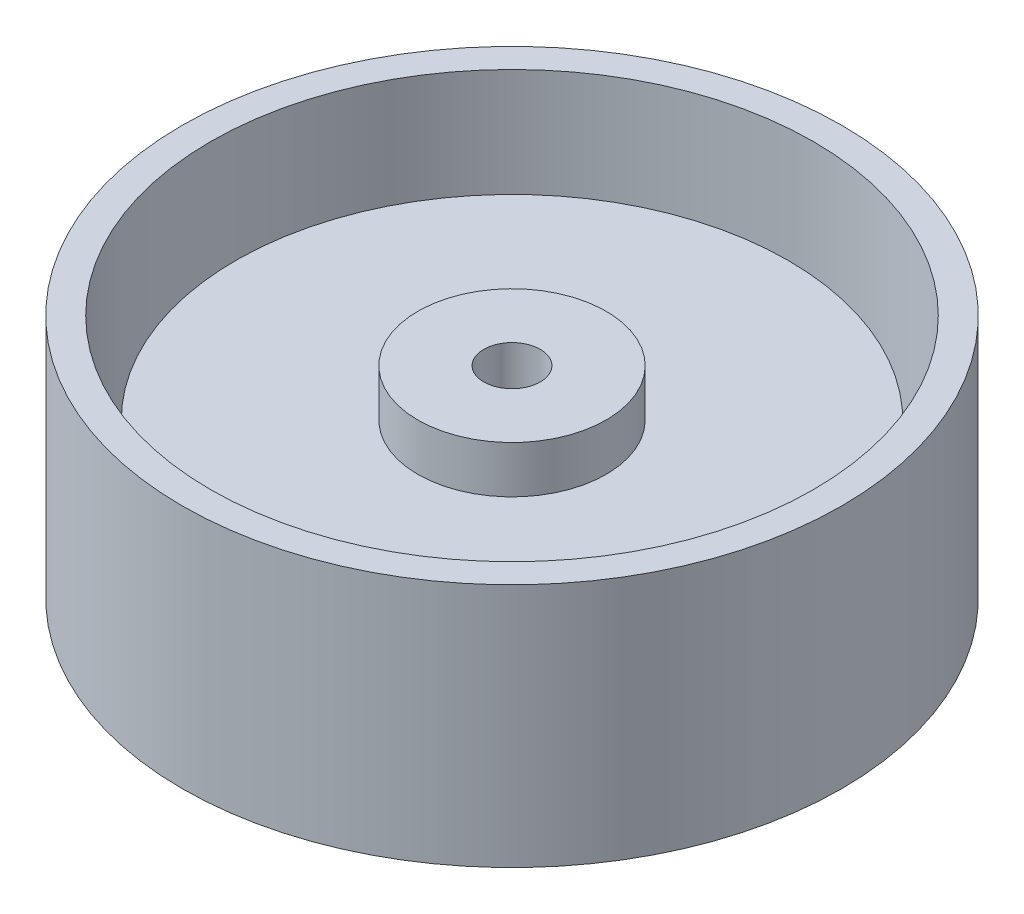
ISO-10303-21;
HEADER;
FILE_DESCRIPTION(('STEP AP214'),'2;1');
FILE_NAME('part.step','',(''),(''),'','','');
FILE_SCHEMA(('AUTOMOTIVE_DESIGN { 1 0 10303 214 1 1 1 1 }'));
ENDSEC;
DATA;
#1=APPLICATION_CONTEXT('core data for automotive mechanical design processes');
#2=APPLICATION_PROTOCOL_DEFINITION('international standard','automotive_design',2000,#1);
#3=PRODUCT_CONTEXT('',#1,'mechanical');
#4=PRODUCT('Part','Part','',(#3));
#5=PRODUCT_RELATED_PRODUCT_CATEGORY('part','',(#4));
#6=PRODUCT_DEFINITION_FORMATION('','',#4);
#7=PRODUCT_DEFINITION_CONTEXT('part definition',#1,'design');
#8=PRODUCT_DEFINITION('design','',#6,#7);
#9=PRODUCT_DEFINITION_SHAPE('','',#8);
#10=(LENGTH_UNIT() NAMED_UNIT(*) SI_UNIT(.MILLI.,.METRE.));
#11=(NAMED_UNIT(*) PLANE_ANGLE_UNIT() SI_UNIT($,.RADIAN.));
#12=(NAMED_UNIT(*) SI_UNIT($,.STERADIAN.) SOLID_ANGLE_UNIT());
#13=UNCERTAINTY_MEASURE_WITH_UNIT(LENGTH_MEASURE(1.E-05),#10,'distance_accuracy_value','');
#14=(GEOMETRIC_REPRESENTATION_CONTEXT(3) GLOBAL_UNCERTAINTY_ASSIGNED_CONTEXT((#13)) GLOBAL_UNIT_ASSIGNED_CONTEXT((#10,
#11,#12)) REPRESENTATION_CONTEXT('',''));
#15=CARTESIAN_POINT('',(0.,0.,0.));
#16=DIRECTION('',(0.,0.,1.));
#17=DIRECTION('',(1.,0.,0.));
#18=AXIS2_PLACEMENT_3D('',#15,#16,#17);
#19=CARTESIAN_POINT('',(0.,16.4,0.));
#20=DIRECTION('',(0.,1.,0.));
#21=DIRECTION('',(0.,0.,1.));
#22=AXIS2_PLACEMENT_3D('',#19,#20,#21);
#23=PLANE('',#22);
#24=CARTESIAN_POINT('',(0.,16.4,0.));
#25=DIRECTION('',(0.,1.,0.));
#26=DIRECTION('',(0.,0.,1.));
#27=AXIS2_PLACEMENT_3D('',#24,#25,#26);
#28=CIRCLE('',#27,29.33);
#29=CARTESIAN_POINT('',(0.,16.4,-29.33));
#30=VERTEX_POINT('',#29);
#31=EDGE_CURVE('E101',#30,#30,#28,.T.);
#32=ORIENTED_EDGE('',*,*,#31,.T.);
#33=EDGE_LOOP('',(#32));
#34=FACE_BOUND('',#33,.T.);
#35=CARTESIAN_POINT('',(0.,16.4,0.));
#36=DIRECTION('',(0.,1.,0.));
#37=DIRECTION('',(0.,0.,1.));
#38=AXIS2_PLACEMENT_3D('',#35,#36,#37);
#39=CIRCLE('',#38,10.);
#40=CARTESIAN_POINT('',(0.,16.4,10.));
#41=VERTEX_POINT('',#40);
#42=EDGE_CURVE('E254',#41,#41,#39,.T.);
#43=ORIENTED_EDGE('',*,*,#42,.F.);
#44=EDGE_LOOP('',(#43));
#45=FACE_BOUND('',#44,.T.);
#46=ADVANCED_FACE('F58',(#34,#45),#23,.T.);
#47=CARTESIAN_POINT('',(0.,3.5,0.));
#48=DIRECTION('',(0.,1.,0.));
#49=DIRECTION('',(0.,0.,1.));
#50=AXIS2_PLACEMENT_3D('',#47,#48,#49);
#51=PLANE('',#50);
#52=CARTESIAN_POINT('',(0.,3.5,0.));
#53=DIRECTION('',(0.,1.,0.));
#54=DIRECTION('',(0.,0.,1.));
#55=AXIS2_PLACEMENT_3D('',#52,#53,#54);
#56=CIRCLE('',#55,29.33);
#57=CARTESIAN_POINT('',(0.,3.5,-29.33));
#58=VERTEX_POINT('',#57);
#59=EDGE_CURVE('E97',#58,#58,#56,.T.);
#60=ORIENTED_EDGE('',*,*,#59,.F.);
#61=EDGE_LOOP('',(#60));
#62=FACE_BOUND('',#61,.T.);
#63=CARTESIAN_POINT('',(0.,3.5,0.));
#64=DIRECTION('',(0.,1.,0.));
#65=DIRECTION('',(0.,0.,1.));
#66=AXIS2_PLACEMENT_3D('',#63,#64,#65);
#67=CIRCLE('',#66,32.);
#68=CARTESIAN_POINT('',(0.,3.5,-32.));
#69=VERTEX_POINT('',#68);
#70=EDGE_CURVE('E12',#69,#69,#67,.F.);
#71=ORIENTED_EDGE('',*,*,#70,.F.);
#72=EDGE_LOOP('',(#71));
#73=FACE_BOUND('',#72,.T.);
#74=ADVANCED_FACE('F130',(#62,#73),#51,.T.);
#75=CARTESIAN_POINT('',(0.,3.5,0.));
#76=DIRECTION('',(0.,-1.,0.));
#77=DIRECTION('',(0.,0.,-1.));
#78=AXIS2_PLACEMENT_3D('',#75,#76,#77);
#79=CYLINDRICAL_SURFACE('',#78,35.);
#80=CARTESIAN_POINT('',(0.,0.,0.));
#81=DIRECTION('',(0.,1.,0.));
#82=DIRECTION('',(0.,0.,1.));
#83=AXIS2_PLACEMENT_3D('',#80,#81,#82);
#84=CIRCLE('',#83,35.);
#85=CARTESIAN_POINT('',(0.,0.,35.));
#86=VERTEX_POINT('',#85);
#87=EDGE_CURVE('E62',#86,#86,#84,.T.);
#88=ORIENTED_EDGE('',*,*,#87,.T.);
#89=EDGE_LOOP('',(#88));
#90=FACE_BOUND('',#89,.T.);
#91=CARTESIAN_POINT('',(0.,26.,0.));
#92=DIRECTION('',(0.,1.,0.));
#93=DIRECTION('',(0.,0.,1.));
#94=AXIS2_PLACEMENT_3D('',#91,#92,#93);
#95=CIRCLE('',#94,35.);
#96=CARTESIAN_POINT('',(0.,26.,35.));
#97=VERTEX_POINT('',#96);
#98=EDGE_CURVE('E112',#97,#97,#95,.T.);
#99=ORIENTED_EDGE('',*,*,#98,.F.);
#100=EDGE_LOOP('',(#99));
#101=FACE_BOUND('',#100,.T.);
#102=ADVANCED_FACE('F60',(#90,#101),#79,.T.);
#103=CARTESIAN_POINT('',(0.,0.,0.));
#104=DIRECTION('',(0.,1.,0.));
#105=DIRECTION('',(0.,0.,1.));
#106=AXIS2_PLACEMENT_3D('',#103,#104,#105);
#107=PLANE('',#106);
#108=ORIENTED_EDGE('',*,*,#87,.F.);
#109=EDGE_LOOP('',(#108));
#110=FACE_BOUND('',#109,.T.);
#111=ADVANCED_FACE('F121',(#110),#107,.F.);
#112=CARTESIAN_POINT('',(0.,26.,0.));
#113=DIRECTION('',(0.,1.,0.));
#114=DIRECTION('',(0.,0.,1.));
#115=AXIS2_PLACEMENT_3D('',#112,#113,#114);
#116=PLANE('',#115);
#117=ORIENTED_EDGE('',*,*,#98,.T.);
#118=EDGE_LOOP('',(#117));
#119=FACE_BOUND('',#118,.T.);
#120=CARTESIAN_POINT('',(0.,26.,0.));
#121=DIRECTION('',(0.,1.,0.));
#122=DIRECTION('',(0.,0.,1.));
#123=AXIS2_PLACEMENT_3D('',#120,#121,#122);
#124=CIRCLE('',#123,32.);
#125=CARTESIAN_POINT('',(0.,26.,-32.));
#126=VERTEX_POINT('',#125);
#127=EDGE_CURVE('E109',#126,#126,#124,.T.);
#128=ORIENTED_EDGE('',*,*,#127,.F.);
#129=EDGE_LOOP('',(#128));
#130=FACE_BOUND('',#129,.T.);
#131=ADVANCED_FACE('F123',(#119,#130),#116,.T.);
#132=CARTESIAN_POINT('',(0.,26.,0.));
#133=DIRECTION('',(0.,-1.,0.));
#134=DIRECTION('',(0.,0.,-1.));
#135=AXIS2_PLACEMENT_3D('',#132,#133,#134);
#136=CYLINDRICAL_SURFACE('',#135,32.);
#137=CARTESIAN_POINT('',(0.,3.5,-32.));
#138=CARTESIAN_POINT('',(0.,3.734375,-32.));
#139=CARTESIAN_POINT('',(0.,3.96875,-32.));
#140=CARTESIAN_POINT('',(0.,4.4375,-32.));
#141=CARTESIAN_POINT('',(0.,4.671875,-32.));
#142=CARTESIAN_POINT('',(0.,5.140625,-32.));
#143=CARTESIAN_POINT('',(0.,5.375,-32.));
#144=CARTESIAN_POINT('',(0.,5.84375,-32.));
#145=CARTESIAN_POINT('',(0.,6.078125,-32.));
#146=CARTESIAN_POINT('',(0.,6.546875,-32.));
#147=CARTESIAN_POINT('',(0.,6.78125,-32.));
#148=CARTESIAN_POINT('',(0.,7.25,-32.));
#149=CARTESIAN_POINT('',(0.,7.484375,-32.));
#150=CARTESIAN_POINT('',(0.,7.953125,-32.));
#151=CARTESIAN_POINT('',(0.,8.18749999999999,-32.));
#152=CARTESIAN_POINT('',(0.,8.65624999999999,-32.));
#153=CARTESIAN_POINT('',(0.,8.890625,-32.));
#154=CARTESIAN_POINT('',(0.,9.359375,-32.));
#155=CARTESIAN_POINT('',(0.,9.59375,-32.));
#156=CARTESIAN_POINT('',(0.,10.0625,-32.));
#157=CARTESIAN_POINT('',(0.,10.296875,-32.));
#158=CARTESIAN_POINT('',(0.,10.765625,-32.));
#159=CARTESIAN_POINT('',(0.,11.,-32.));
#160=CARTESIAN_POINT('',(0.,11.46875,-32.));
#161=CARTESIAN_POINT('',(0.,11.703125,-32.));
#162=CARTESIAN_POINT('',(0.,12.171875,-32.));
#163=CARTESIAN_POINT('',(0.,12.40625,-32.));
#164=CARTESIAN_POINT('',(0.,12.875,-32.));
#165=CARTESIAN_POINT('',(0.,13.109375,-32.));
#166=CARTESIAN_POINT('',(0.,13.578125,-32.));
#167=CARTESIAN_POINT('',(0.,13.8125,-32.));
#168=CARTESIAN_POINT('',(0.,14.28125,-32.));
#169=CARTESIAN_POINT('',(0.,14.515625,-32.));
#170=CARTESIAN_POINT('',(0.,14.984375,-32.));
#171=CARTESIAN_POINT('',(0.,15.21875,-32.));
#172=CARTESIAN_POINT('',(0.,15.6875,-32.));
#173=CARTESIAN_POINT('',(0.,15.921875,-32.));
#174=CARTESIAN_POINT('',(0.,16.390625,-32.));
#175=CARTESIAN_POINT('',(0.,16.625,-32.));
#176=CARTESIAN_POINT('',(0.,17.09375,-32.));
#177=CARTESIAN_POINT('',(0.,17.328125,-32.));
#178=CARTESIAN_POINT('',(0.,17.796875,-32.));
#179=CARTESIAN_POINT('',(0.,18.03125,-32.));
#180=CARTESIAN_POINT('',(0.,18.5,-32.));
#181=CARTESIAN_POINT('',(0.,18.734375,-32.));
#182=CARTESIAN_POINT('',(0.,19.203125,-32.));
#183=CARTESIAN_POINT('',(0.,19.4375,-32.));
#184=CARTESIAN_POINT('',(0.,19.90625,-32.));
#185=CARTESIAN_POINT('',(0.,20.140625,-32.));
#186=CARTESIAN_POINT('',(0.,20.609375,-32.));
#187=CARTESIAN_POINT('',(0.,20.84375,-32.));
#188=CARTESIAN_POINT('',(0.,21.3125,-32.));
#189=CARTESIAN_POINT('',(0.,21.546875,-32.));
#190=CARTESIAN_POINT('',(0.,22.015625,-32.));
#191=CARTESIAN_POINT('',(0.,22.25,-32.));
#192=CARTESIAN_POINT('',(0.,22.71875,-32.));
#193=CARTESIAN_POINT('',(0.,22.953125,-32.));
#194=CARTESIAN_POINT('',(0.,23.421875,-32.));
#195=CARTESIAN_POINT('',(0.,23.65625,-32.));
#196=CARTESIAN_POINT('',(0.,24.125,-32.));
#197=CARTESIAN_POINT('',(0.,24.359375,-32.));
#198=CARTESIAN_POINT('',(0.,24.828125,-32.));
#199=CARTESIAN_POINT('',(0.,25.0625,-32.));
#200=CARTESIAN_POINT('',(0.,25.53125,-32.));
#201=CARTESIAN_POINT('',(0.,25.765625,-32.));
#202=CARTESIAN_POINT('',(0.,26.,-32.));
#203=B_SPLINE_CURVE_WITH_KNOTS('',3,(#137,#138,#139,#140,#141,#142,#143,#144,#145,#146,#147,
#148,#149,#150,#151,#152,#153,#154,#155,#156,#157,#158,#159,#160,#161,#162,#163,#164,#165,#166,
#167,#168,#169,#170,#171,#172,#173,#174,#175,#176,#177,#178,#179,#180,#181,#182,#183,#184,#185,
#186,#187,#188,#189,#190,#191,#192,#193,#194,#195,#196,#197,#198,#199,#200,#201,#202),
.UNSPECIFIED.,.F.,.F.,(4,2,2,2,2,2,2,2,2,2,2,2,2,2,2,2,2,2,2,2,2,2,2,2,2,2,2,2,2,2,2,2,4),(0.,
0.703124999999999,1.40625,2.109375,2.8125,3.515625,4.21875,4.921875,5.625,6.328125,7.03125,
7.734375,8.4375,9.140625,9.84375,10.546875,11.25,11.953125,12.65625,13.359375,14.0625,14.765625,
15.46875,16.171875,16.875,17.578125,18.28125,18.984375,19.6875,20.390625,21.09375,21.796875,
22.5),.UNSPECIFIED.);
#204=EDGE_CURVE('BSEAM128',#69,#126,#203,.T.);
#205=ORIENTED_EDGE('',*,*,#70,.T.);
#206=ORIENTED_EDGE('',*,*,#127,.T.);
#207=ORIENTED_EDGE('',*,*,#204,.T.);
#208=ORIENTED_EDGE('',*,*,#204,.F.);
#209=EDGE_LOOP('',(#205,#207,#206,#208));
#210=FACE_BOUND('',#209,.T.);
#211=ADVANCED_FACE('F128',(#210),#136,.F.);
#212=CARTESIAN_POINT('',(0.,16.4,0.));
#213=DIRECTION('',(0.,-1.,0.));
#214=DIRECTION('',(0.,0.,-1.));
#215=AXIS2_PLACEMENT_3D('',#212,#213,#214);
#216=CYLINDRICAL_SURFACE('',#215,29.33);
#217=CARTESIAN_POINT('',(0.,16.4,-29.33));
#218=CARTESIAN_POINT('',(0.,16.265625,-29.33));
#219=CARTESIAN_POINT('',(0.,16.13125,-29.33));
#220=CARTESIAN_POINT('',(0.,15.8625,-29.33));
#221=CARTESIAN_POINT('',(0.,15.728125,-29.33));
#222=CARTESIAN_POINT('',(0.,15.459375,-29.33));
#223=CARTESIAN_POINT('',(0.,15.325,-29.33));
#224=CARTESIAN_POINT('',(0.,15.05625,-29.33));
#225=CARTESIAN_POINT('',(0.,14.921875,-29.33));
#226=CARTESIAN_POINT('',(0.,14.653125,-29.33));
#227=CARTESIAN_POINT('',(0.,14.51875,-29.33));
#228=CARTESIAN_POINT('',(0.,14.25,-29.33));
#229=CARTESIAN_POINT('',(0.,14.115625,-29.33));
#230=CARTESIAN_POINT('',(0.,13.846875,-29.33));
#231=CARTESIAN_POINT('',(0.,13.7125,-29.33));
#232=CARTESIAN_POINT('',(0.,13.44375,-29.33));
#233=CARTESIAN_POINT('',(0.,13.309375,-29.33));
#234=CARTESIAN_POINT('',(0.,13.040625,-29.33));
#235=CARTESIAN_POINT('',(0.,12.90625,-29.33));
#236=CARTESIAN_POINT('',(0.,12.6375,-29.33));
#237=CARTESIAN_POINT('',(0.,12.503125,-29.33));
#238=CARTESIAN_POINT('',(0.,12.234375,-29.33));
#239=CARTESIAN_POINT('',(0.,12.1,-29.33));
#240=CARTESIAN_POINT('',(0.,11.83125,-29.33));
#241=CARTESIAN_POINT('',(0.,11.696875,-29.33));
#242=CARTESIAN_POINT('',(0.,11.428125,-29.33));
#243=CARTESIAN_POINT('',(0.,11.29375,-29.33));
#244=CARTESIAN_POINT('',(0.,11.025,-29.33));
#245=CARTESIAN_POINT('',(0.,10.890625,-29.33));
#246=CARTESIAN_POINT('',(0.,10.621875,-29.33));
#247=CARTESIAN_POINT('',(0.,10.4875,-29.33));
#248=CARTESIAN_POINT('',(0.,10.21875,-29.33));
#249=CARTESIAN_POINT('',(0.,10.084375,-29.33));
#250=CARTESIAN_POINT('',(0.,9.815625,-29.33));
#251=CARTESIAN_POINT('',(0.,9.68125,-29.33));
#252=CARTESIAN_POINT('',(0.,9.4125,-29.33));
#253=CARTESIAN_POINT('',(0.,9.278125,-29.33));
#254=CARTESIAN_POINT('',(0.,9.009375,-29.33));
#255=CARTESIAN_POINT('',(0.,8.875,-29.33));
#256=CARTESIAN_POINT('',(0.,8.60625,-29.33));
#257=CARTESIAN_POINT('',(0.,8.471875,-29.33));
#258=CARTESIAN_POINT('',(0.,8.203125,-29.33));
#259=CARTESIAN_POINT('',(0.,8.06875,-29.33));
#260=CARTESIAN_POINT('',(0.,7.8,-29.33));
#261=CARTESIAN_POINT('',(0.,7.665625,-29.33));
#262=CARTESIAN_POINT('',(0.,7.396875,-29.33));
#263=CARTESIAN_POINT('',(0.,7.2625,-29.33));
#264=CARTESIAN_POINT('',(0.,6.99375,-29.33));
#265=CARTESIAN_POINT('',(0.,6.859375,-29.33));
#266=CARTESIAN_POINT('',(0.,6.590625,-29.33));
#267=CARTESIAN_POINT('',(0.,6.45625,-29.33));
#268=CARTESIAN_POINT('',(0.,6.1875,-29.33));
#269=CARTESIAN_POINT('',(0.,6.053125,-29.33));
#270=CARTESIAN_POINT('',(0.,5.784375,-29.33));
#271=CARTESIAN_POINT('',(0.,5.65,-29.33));
#272=CARTESIAN_POINT('',(0.,5.38125,-29.33));
#273=CARTESIAN_POINT('',(0.,5.246875,-29.33));
#274=CARTESIAN_POINT('',(0.,4.978125,-29.33));
#275=CARTESIAN_POINT('',(0.,4.84375,-29.33));
#276=CARTESIAN_POINT('',(0.,4.575,-29.33));
#277=CARTESIAN_POINT('',(0.,4.440625,-29.33));
#278=CARTESIAN_POINT('',(0.,4.171875,-29.33));
#279=CARTESIAN_POINT('',(0.,4.0375,-29.33));
#280=CARTESIAN_POINT('',(0.,3.76875,-29.33));
#281=CARTESIAN_POINT('',(0.,3.634375,-29.33));
#282=CARTESIAN_POINT('',(0.,3.5,-29.33));
#283=B_SPLINE_CURVE_WITH_KNOTS('',3,(#217,#218,#219,#220,#221,#222,#223,#224,#225,#226,#227,
#228,#229,#230,#231,#232,#233,#234,#235,#236,#237,#238,#239,#240,#241,#242,#243,#244,#245,#246,
#247,#248,#249,#250,#251,#252,#253,#254,#255,#256,#257,#258,#259,#260,#261,#262,#263,#264,#265,
#266,#267,#268,#269,#270,#271,#272,#273,#274,#275,#276,#277,#278,#279,#280,#281,#282),
.UNSPECIFIED.,.F.,.F.,(4,2,2,2,2,2,2,2,2,2,2,2,2,2,2,2,2,2,2,2,2,2,2,2,2,2,2,2,2,2,2,2,4),(0.,
0.403125000000001,0.806250000000001,1.209375,1.6125,2.015625,2.41875,2.821875,3.225,3.628125,
4.03125,4.434375,4.8375,5.240625,5.64375,6.046875,6.45,6.853125,7.25625,7.659375,8.0625,
8.465625,8.86875,9.271875,9.675,10.078125,10.48125,10.884375,11.2875,11.690625,12.09375,
12.496875,12.9),.UNSPECIFIED.);
#284=EDGE_CURVE('BSEAM143',#30,#58,#283,.T.);
#285=ORIENTED_EDGE('',*,*,#31,.F.);
#286=ORIENTED_EDGE('',*,*,#59,.T.);
#287=ORIENTED_EDGE('',*,*,#284,.T.);
#288=ORIENTED_EDGE('',*,*,#284,.F.);
#289=EDGE_LOOP('',(#285,#287,#286,#288));
#290=FACE_BOUND('',#289,.T.);
#291=ADVANCED_FACE('F143',(#290),#216,.T.);
#292=CARTESIAN_POINT('',(0.,21.4,0.));
#293=DIRECTION('',(0.,1.,0.));
#294=DIRECTION('',(0.,0.,1.));
#295=AXIS2_PLACEMENT_3D('',#292,#293,#294);
#296=PLANE('',#295);
#297=CARTESIAN_POINT('',(0.,21.4,0.));
#298=DIRECTION('',(0.,1.,0.));
#299=DIRECTION('',(0.,0.,1.));
#300=AXIS2_PLACEMENT_3D('',#297,#298,#299);
#301=CIRCLE('',#300,10.);
#302=CARTESIAN_POINT('',(0.,21.4,10.));
#303=VERTEX_POINT('',#302);
#304=EDGE_CURVE('E98',#303,#303,#301,.T.);
#305=ORIENTED_EDGE('',*,*,#304,.T.);
#306=EDGE_LOOP('',(#305));
#307=FACE_BOUND('',#306,.T.);
#308=CARTESIAN_POINT('',(0.,21.4,0.));
#309=DIRECTION('',(0.,1.,0.));
#310=DIRECTION('',(0.,0.,1.));
#311=AXIS2_PLACEMENT_3D('',#308,#309,#310);
#312=CIRCLE('',#311,3.);
#313=CARTESIAN_POINT('',(0.,21.4,3.));
#314=VERTEX_POINT('',#313);
#315=EDGE_CURVE('E255',#314,#314,#312,.T.);
#316=ORIENTED_EDGE('',*,*,#315,.F.);
#317=EDGE_LOOP('',(#316));
#318=FACE_BOUND('',#317,.T.);
#319=ADVANCED_FACE('F146',(#307,#318),#296,.T.);
#320=CARTESIAN_POINT('',(0.,21.4,0.));
#321=DIRECTION('',(0.,-1.,0.));
#322=DIRECTION('',(0.,0.,-1.));
#323=AXIS2_PLACEMENT_3D('',#320,#321,#322);
#324=CYLINDRICAL_SURFACE('',#323,10.);
#325=ORIENTED_EDGE('',*,*,#304,.F.);
#326=EDGE_LOOP('',(#325));
#327=FACE_BOUND('',#326,.T.);
#328=ORIENTED_EDGE('',*,*,#42,.T.);
#329=EDGE_LOOP('',(#328));
#330=FACE_BOUND('',#329,.T.);
#331=ADVANCED_FACE('F151',(#327,#330),#324,.T.);
#332=CARTESIAN_POINT('',(0.,13.5,0.));
#333=DIRECTION('',(0.,1.,0.));
#334=DIRECTION('',(0.,0.,1.));
#335=AXIS2_PLACEMENT_3D('',#332,#333,#334);
#336=PLANE('',#335);
#337=CARTESIAN_POINT('',(0.,13.5,0.));
#338=DIRECTION('',(0.,1.,0.));
#339=DIRECTION('',(0.,0.,1.));
#340=AXIS2_PLACEMENT_3D('',#337,#338,#339);
#341=CIRCLE('',#340,3.);
#342=CARTESIAN_POINT('',(2.59807621135332,13.5,-1.5));
#343=VERTEX_POINT('',#342);
#344=CARTESIAN_POINT('',(-2.59807621135332,13.5,-1.5));
#345=VERTEX_POINT('',#344);
#346=EDGE_CURVE('E78',#343,#345,#341,.T.);
#347=ORIENTED_EDGE('',*,*,#346,.T.);
#348=DIRECTION('',(1.,0.,0.));
#349=VECTOR('',#348,1.);
#350=CARTESIAN_POINT('',(0.,13.5,-1.5));
#351=LINE('',#350,#349);
#352=EDGE_CURVE('E91',#345,#343,#351,.T.);
#353=ORIENTED_EDGE('',*,*,#352,.T.);
#354=EDGE_LOOP('',(#347,#353));
#355=FACE_BOUND('',#354,.T.);
#356=ADVANCED_FACE('F148',(#355),#336,.T.);
#357=CARTESIAN_POINT('',(0.,3.5,0.));
#358=DIRECTION('',(0.,1.,0.));
#359=DIRECTION('',(0.,0.,1.));
#360=AXIS2_PLACEMENT_3D('',#357,#358,#359);
#361=CIRCLE('',#360,3.);
#362=CARTESIAN_POINT('',(-2.59807621135332,3.5,-1.5));
#363=VERTEX_POINT('',#362);
#364=CARTESIAN_POINT('',(2.59807621135332,3.5,-1.5));
#365=VERTEX_POINT('',#364);
#366=EDGE_CURVE('E88',#363,#365,#361,.T.);
#367=ORIENTED_EDGE('',*,*,#366,.T.);
#368=DIRECTION('',(1.,0.,0.));
#369=VECTOR('',#368,1.);
#370=CARTESIAN_POINT('',(0.,3.5,-1.5));
#371=LINE('',#370,#369);
#372=EDGE_CURVE('E96',#363,#365,#371,.T.);
#373=ORIENTED_EDGE('',*,*,#372,.F.);
#374=EDGE_LOOP('',(#367,#373));
#375=FACE_BOUND('',#374,.T.);
#376=ADVANCED_FACE('F95',(#375),#51,.T.);
#377=CARTESIAN_POINT('',(0.,13.5,-1.5));
#378=DIRECTION('',(0.,0.,-1.));
#379=DIRECTION('',(-1.,0.,0.));
#380=AXIS2_PLACEMENT_3D('',#377,#378,#379);
#381=PLANE('',#380);
#382=ORIENTED_EDGE('',*,*,#372,.T.);
#383=DIRECTION('',(0.,-1.,0.));
#384=VECTOR('',#383,1.);
#385=CARTESIAN_POINT('',(2.59807621135332,13.5,-1.5));
#386=LINE('',#385,#384);
#387=EDGE_CURVE('E84',#343,#365,#386,.T.);
#388=ORIENTED_EDGE('',*,*,#387,.F.);
#389=ORIENTED_EDGE('',*,*,#352,.F.);
#390=DIRECTION('',(0.,-1.,0.));
#391=VECTOR('',#390,1.);
#392=CARTESIAN_POINT('',(-2.59807621135332,13.5,-1.5));
#393=LINE('',#392,#391);
#394=EDGE_CURVE('E73',#345,#363,#393,.T.);
#395=ORIENTED_EDGE('',*,*,#394,.T.);
#396=EDGE_LOOP('',(#382,#388,#389,#395));
#397=FACE_BOUND('',#396,.T.);
#398=ADVANCED_FACE('F100',(#397),#381,.F.);
#399=CARTESIAN_POINT('',(0.,16.4,0.));
#400=DIRECTION('',(0.,-1.,0.));
#401=DIRECTION('',(0.,0.,-1.));
#402=AXIS2_PLACEMENT_3D('',#399,#400,#401);
#403=CYLINDRICAL_SURFACE('',#402,3.);
#404=ORIENTED_EDGE('',*,*,#387,.T.);
#405=ORIENTED_EDGE('',*,*,#366,.F.);
#406=ORIENTED_EDGE('',*,*,#394,.F.);
#407=ORIENTED_EDGE('',*,*,#346,.F.);
#408=EDGE_LOOP('',(#404,#405,#406,#407));
#409=FACE_BOUND('',#408,.T.);
#410=ORIENTED_EDGE('',*,*,#315,.T.);
#411=EDGE_LOOP('',(#410));
#412=FACE_BOUND('',#411,.T.);
#413=ADVANCED_FACE('F86',(#409,#412),#403,.F.);
#414=CLOSED_SHELL('',(#46,#74,#102,#111,#131,#211,#291,#319,#331,#356,#376,#398,#413));
#415=MANIFOLD_SOLID_BREP('B2',#414);
#416=ADVANCED_BREP_SHAPE_REPRESENTATION('',(#18,#415),#14);
#417=SHAPE_DEFINITION_REPRESENTATION(#9,#416);
ENDSEC;
END-ISO-10303-21;
